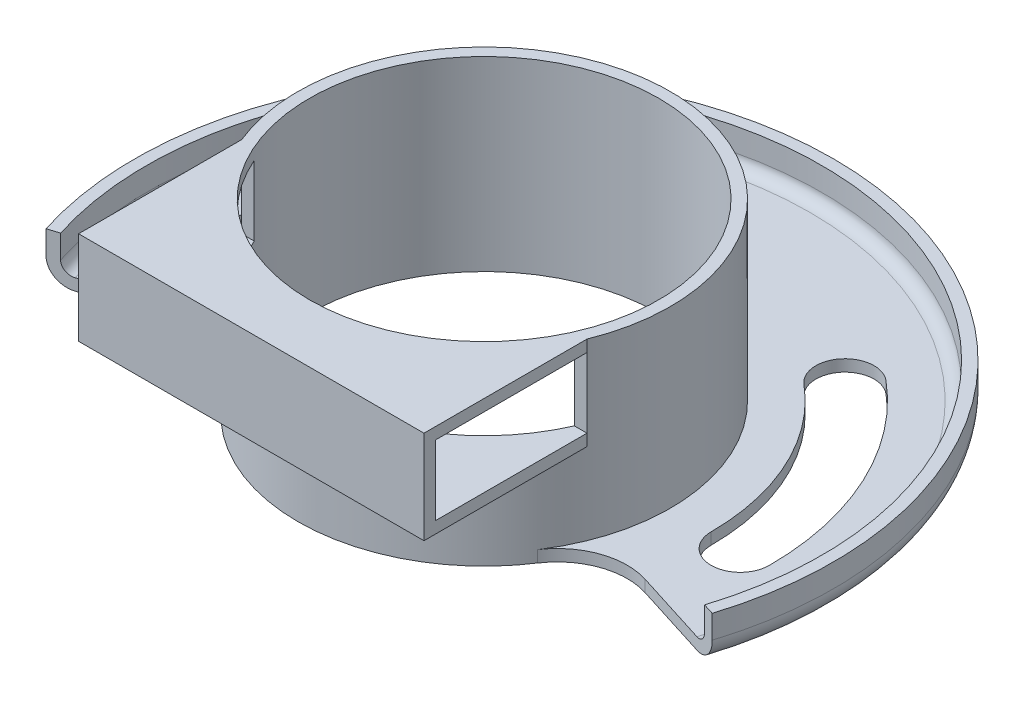
ISO-10303-21;
HEADER;
FILE_DESCRIPTION(('STEP AP214'),'2;1');
FILE_NAME('part.step','',(''),(''),'','','');
FILE_SCHEMA(('AUTOMOTIVE_DESIGN { 1 0 10303 214 1 1 1 1 }'));
ENDSEC;
DATA;
#1=APPLICATION_CONTEXT('core data for automotive mechanical design processes');
#2=APPLICATION_PROTOCOL_DEFINITION('international standard','automotive_design',2000,#1);
#3=PRODUCT_CONTEXT('',#1,'mechanical');
#4=PRODUCT('Part','Part','',(#3));
#5=PRODUCT_RELATED_PRODUCT_CATEGORY('part','',(#4));
#6=PRODUCT_DEFINITION_FORMATION('','',#4);
#7=PRODUCT_DEFINITION_CONTEXT('part definition',#1,'design');
#8=PRODUCT_DEFINITION('design','',#6,#7);
#9=PRODUCT_DEFINITION_SHAPE('','',#8);
#10=(LENGTH_UNIT() NAMED_UNIT(*) SI_UNIT(.MILLI.,.METRE.));
#11=(NAMED_UNIT(*) PLANE_ANGLE_UNIT() SI_UNIT($,.RADIAN.));
#12=(NAMED_UNIT(*) SI_UNIT($,.STERADIAN.) SOLID_ANGLE_UNIT());
#13=UNCERTAINTY_MEASURE_WITH_UNIT(LENGTH_MEASURE(1.E-05),#10,'distance_accuracy_value','');
#14=(GEOMETRIC_REPRESENTATION_CONTEXT(3) GLOBAL_UNCERTAINTY_ASSIGNED_CONTEXT((#13)) GLOBAL_UNIT_ASSIGNED_CONTEXT((#10,
#11,#12)) REPRESENTATION_CONTEXT('',''));
#15=CARTESIAN_POINT('',(0.,0.,0.));
#16=DIRECTION('',(0.,0.,1.));
#17=DIRECTION('',(1.,0.,0.));
#18=AXIS2_PLACEMENT_3D('',#15,#16,#17);
#19=CARTESIAN_POINT('',(14.8323969741913,8.,6.));
#20=DIRECTION('',(1.,0.,0.));
#21=DIRECTION('',(0.,0.,-1.));
#22=AXIS2_PLACEMENT_3D('',#19,#20,#21);
#23=PLANE('',#22);
#24=DIRECTION('',(0.,1.,0.));
#25=VECTOR('',#24,1.);
#26=CARTESIAN_POINT('',(14.8323969741913,8.,19.));
#27=LINE('',#26,#25);
#28=CARTESIAN_POINT('',(14.8323969741913,9.,19.));
#29=VERTEX_POINT('',#28);
#30=CARTESIAN_POINT('',(14.8323969741913,15.,19.));
#31=VERTEX_POINT('',#30);
#32=EDGE_CURVE('E182',#29,#31,#27,.T.);
#33=ORIENTED_EDGE('',*,*,#32,.T.);
#34=DIRECTION('',(0.,0.,-1.));
#35=VECTOR('',#34,1.);
#36=CARTESIAN_POINT('',(14.8323969741913,15.,0.));
#37=LINE('',#36,#35);
#38=CARTESIAN_POINT('',(14.8323969741913,15.,6.));
#39=VERTEX_POINT('',#38);
#40=EDGE_CURVE('E157',#31,#39,#37,.T.);
#41=ORIENTED_EDGE('',*,*,#40,.T.);
#42=DIRECTION('',(0.,1.,0.));
#43=VECTOR('',#42,1.);
#44=CARTESIAN_POINT('',(14.8323969741913,8.,6.));
#45=LINE('',#44,#43);
#46=CARTESIAN_POINT('',(14.8323969741913,16.,6.));
#47=VERTEX_POINT('',#46);
#48=EDGE_CURVE('E217',#39,#47,#45,.T.);
#49=ORIENTED_EDGE('',*,*,#48,.T.);
#50=DIRECTION('',(0.,0.,-1.));
#51=VECTOR('',#50,1.);
#52=CARTESIAN_POINT('',(14.8323969741913,16.,6.));
#53=LINE('',#52,#51);
#54=CARTESIAN_POINT('',(14.8323969741913,16.,20.));
#55=VERTEX_POINT('',#54);
#56=EDGE_CURVE('E188',#55,#47,#53,.T.);
#57=ORIENTED_EDGE('',*,*,#56,.F.);
#58=DIRECTION('',(0.,1.,0.));
#59=VECTOR('',#58,1.);
#60=CARTESIAN_POINT('',(14.8323969741913,8.,20.));
#61=LINE('',#60,#59);
#62=CARTESIAN_POINT('',(14.8323969741913,8.,20.));
#63=VERTEX_POINT('',#62);
#64=EDGE_CURVE('E218',#63,#55,#61,.T.);
#65=ORIENTED_EDGE('',*,*,#64,.F.);
#66=DIRECTION('',(0.,0.,-1.));
#67=VECTOR('',#66,1.);
#68=CARTESIAN_POINT('',(14.8323969741913,8.,6.));
#69=LINE('',#68,#67);
#70=CARTESIAN_POINT('',(14.8323969741913,8.,6.));
#71=VERTEX_POINT('',#70);
#72=EDGE_CURVE('E192',#63,#71,#69,.T.);
#73=ORIENTED_EDGE('',*,*,#72,.T.);
#74=CARTESIAN_POINT('',(14.8323969741913,9.,6.));
#75=VERTEX_POINT('',#74);
#76=EDGE_CURVE('E213',#71,#75,#45,.T.);
#77=ORIENTED_EDGE('',*,*,#76,.T.);
#78=DIRECTION('',(0.,0.,-1.));
#79=VECTOR('',#78,1.);
#80=CARTESIAN_POINT('',(14.8323969741913,9.,0.));
#81=LINE('',#80,#79);
#82=EDGE_CURVE('E166',#29,#75,#81,.T.);
#83=ORIENTED_EDGE('',*,*,#82,.F.);
#84=EDGE_LOOP('',(#33,#41,#49,#57,#65,#73,#77,#83));
#85=FACE_BOUND('',#84,.T.);
#86=ADVANCED_FACE('F53',(#85),#23,.T.);
#87=CARTESIAN_POINT('',(0.,16.,0.));
#88=DIRECTION('',(0.,-1.,0.));
#89=DIRECTION('',(0.,0.,-1.));
#90=AXIS2_PLACEMENT_3D('',#87,#88,#89);
#91=CYLINDRICAL_SURFACE('',#90,16.);
#92=CARTESIAN_POINT('',(0.,8.,0.));
#93=DIRECTION('',(0.,1.,0.));
#94=DIRECTION('',(0.,0.,1.));
#95=AXIS2_PLACEMENT_3D('',#92,#93,#94);
#96=CIRCLE('',#95,16.);
#97=CARTESIAN_POINT('',(-14.8323969741913,8.,6.));
#98=VERTEX_POINT('',#97);
#99=EDGE_CURVE('E211',#98,#71,#96,.T.);
#100=ORIENTED_EDGE('',*,*,#99,.F.);
#101=DIRECTION('',(0.,1.,0.));
#102=VECTOR('',#101,1.);
#103=CARTESIAN_POINT('',(-14.8323969741913,8.,6.));
#104=LINE('',#103,#102);
#105=CARTESIAN_POINT('',(-14.8323969741913,9.,6.));
#106=VERTEX_POINT('',#105);
#107=EDGE_CURVE('E207',#98,#106,#104,.T.);
#108=ORIENTED_EDGE('',*,*,#107,.T.);
#109=DIRECTION('',(0.,-1.,0.));
#110=VECTOR('',#109,1.);
#111=CARTESIAN_POINT('',(-14.8323969741913,9.,6.));
#112=LINE('',#111,#110);
#113=CARTESIAN_POINT('',(-14.8323969741913,15.,6.));
#114=VERTEX_POINT('',#113);
#115=EDGE_CURVE('E173',#106,#114,#112,.F.);
#116=ORIENTED_EDGE('',*,*,#115,.T.);
#117=CARTESIAN_POINT('',(-14.8323969741913,16.,6.));
#118=VERTEX_POINT('',#117);
#119=EDGE_CURVE('E212',#114,#118,#104,.T.);
#120=ORIENTED_EDGE('',*,*,#119,.T.);
#121=CARTESIAN_POINT('',(0.,16.,0.));
#122=DIRECTION('',(0.,1.,0.));
#123=DIRECTION('',(0.,0.,1.));
#124=AXIS2_PLACEMENT_3D('',#121,#122,#123);
#125=CIRCLE('',#124,16.);
#126=EDGE_CURVE('E151',#47,#118,#125,.T.);
#127=ORIENTED_EDGE('',*,*,#126,.F.);
#128=ORIENTED_EDGE('',*,*,#48,.F.);
#129=DIRECTION('',(0.,-1.,0.));
#130=VECTOR('',#129,1.);
#131=CARTESIAN_POINT('',(14.8323969741913,15.,6.));
#132=LINE('',#131,#130);
#133=EDGE_CURVE('E168',#39,#75,#132,.T.);
#134=ORIENTED_EDGE('',*,*,#133,.T.);
#135=ORIENTED_EDGE('',*,*,#76,.F.);
#136=EDGE_LOOP('',(#100,#108,#116,#120,#127,#128,#134,#135));
#137=FACE_BOUND('',#136,.T.);
#138=CARTESIAN_POINT('',(0.,0.,0.));
#139=DIRECTION('',(0.,1.,0.));
#140=DIRECTION('',(0.,0.,1.));
#141=AXIS2_PLACEMENT_3D('',#138,#139,#140);
#142=CIRCLE('',#141,16.);
#143=CARTESIAN_POINT('',(0.,0.,16.));
#144=VERTEX_POINT('',#143);
#145=EDGE_CURVE('E229',#144,#144,#142,.T.);
#146=ORIENTED_EDGE('',*,*,#145,.T.);
#147=EDGE_LOOP('',(#146));
#148=FACE_BOUND('',#147,.T.);
#149=ADVANCED_FACE('F55',(#137,#148),#91,.T.);
#150=CARTESIAN_POINT('',(0.,16.,0.));
#151=DIRECTION('',(0.,1.,0.));
#152=DIRECTION('',(0.,0.,1.));
#153=AXIS2_PLACEMENT_3D('',#150,#151,#152);
#154=PLANE('',#153);
#155=CARTESIAN_POINT('',(0.,16.,0.));
#156=DIRECTION('',(0.,1.,0.));
#157=DIRECTION('',(0.,0.,1.));
#158=AXIS2_PLACEMENT_3D('',#155,#156,#157);
#159=CIRCLE('',#158,15.);
#160=CARTESIAN_POINT('',(0.,16.,15.));
#161=VERTEX_POINT('',#160);
#162=EDGE_CURVE('E225',#161,#161,#159,.T.);
#163=ORIENTED_EDGE('',*,*,#162,.F.);
#164=EDGE_LOOP('',(#163));
#165=FACE_BOUND('',#164,.T.);
#166=ORIENTED_EDGE('',*,*,#126,.T.);
#167=DIRECTION('',(0.,0.,1.));
#168=VECTOR('',#167,1.);
#169=CARTESIAN_POINT('',(-14.8323969741913,16.,6.));
#170=LINE('',#169,#168);
#171=CARTESIAN_POINT('',(-14.8323969741913,16.,20.));
#172=VERTEX_POINT('',#171);
#173=EDGE_CURVE('E172',#118,#172,#170,.T.);
#174=ORIENTED_EDGE('',*,*,#173,.T.);
#175=DIRECTION('',(1.,0.,0.));
#176=VECTOR('',#175,1.);
#177=CARTESIAN_POINT('',(-14.8323969741913,16.,20.));
#178=LINE('',#177,#176);
#179=EDGE_CURVE('E200',#172,#55,#178,.T.);
#180=ORIENTED_EDGE('',*,*,#179,.T.);
#181=ORIENTED_EDGE('',*,*,#56,.T.);
#182=EDGE_LOOP('',(#166,#174,#180,#181));
#183=FACE_BOUND('',#182,.T.);
#184=ADVANCED_FACE('F240',(#165,#183),#154,.T.);
#185=CARTESIAN_POINT('',(0.,0.,0.));
#186=DIRECTION('',(0.,1.,0.));
#187=DIRECTION('',(0.,0.,1.));
#188=AXIS2_PLACEMENT_3D('',#185,#186,#187);
#189=PLANE('',#188);
#190=CARTESIAN_POINT('',(0.,0.,0.));
#191=DIRECTION('',(0.,1.,0.));
#192=DIRECTION('',(0.,0.,1.));
#193=AXIS2_PLACEMENT_3D('',#190,#191,#192);
#194=CIRCLE('',#193,15.);
#195=CARTESIAN_POINT('',(0.,0.,15.));
#196=VERTEX_POINT('',#195);
#197=EDGE_CURVE('E407',#196,#196,#194,.T.);
#198=ORIENTED_EDGE('',*,*,#197,.T.);
#199=EDGE_LOOP('',(#198));
#200=FACE_BOUND('',#199,.T.);
#201=ORIENTED_EDGE('',*,*,#145,.F.);
#202=EDGE_LOOP('',(#201));
#203=FACE_BOUND('',#202,.T.);
#204=ADVANCED_FACE('F238',(#200,#203),#189,.F.);
#205=CARTESIAN_POINT('',(0.,16.,0.));
#206=DIRECTION('',(0.,-1.,0.));
#207=DIRECTION('',(0.,0.,-1.));
#208=AXIS2_PLACEMENT_3D('',#205,#206,#207);
#209=CYLINDRICAL_SURFACE('',#208,15.);
#210=ORIENTED_EDGE('',*,*,#162,.T.);
#211=EDGE_LOOP('',(#210));
#212=FACE_BOUND('',#211,.T.);
#213=DIRECTION('',(0.,-1.,0.));
#214=VECTOR('',#213,1.);
#215=CARTESIAN_POINT('',(-13.7477270848675,16.,6.));
#216=LINE('',#215,#214);
#217=CARTESIAN_POINT('',(-13.7477270848675,9.,6.));
#218=VERTEX_POINT('',#217);
#219=CARTESIAN_POINT('',(-13.7477270848675,15.,6.));
#220=VERTEX_POINT('',#219);
#221=EDGE_CURVE('E62',#218,#220,#216,.F.);
#222=ORIENTED_EDGE('',*,*,#221,.F.);
#223=CARTESIAN_POINT('',(0.,9.,0.));
#224=DIRECTION('',(0.,1.,0.));
#225=DIRECTION('',(0.,0.,1.));
#226=AXIS2_PLACEMENT_3D('',#223,#224,#225);
#227=CIRCLE('',#226,15.);
#228=CARTESIAN_POINT('',(13.7477270848675,9.,6.));
#229=VERTEX_POINT('',#228);
#230=EDGE_CURVE('E142',#218,#229,#227,.T.);
#231=ORIENTED_EDGE('',*,*,#230,.T.);
#232=DIRECTION('',(0.,-1.,0.));
#233=VECTOR('',#232,1.);
#234=CARTESIAN_POINT('',(13.7477270848675,16.,6.));
#235=LINE('',#234,#233);
#236=CARTESIAN_POINT('',(13.7477270848675,15.,6.));
#237=VERTEX_POINT('',#236);
#238=EDGE_CURVE('E12',#237,#229,#235,.T.);
#239=ORIENTED_EDGE('',*,*,#238,.F.);
#240=CARTESIAN_POINT('',(0.,15.,0.));
#241=DIRECTION('',(0.,1.,0.));
#242=DIRECTION('',(0.,0.,1.));
#243=AXIS2_PLACEMENT_3D('',#240,#241,#242);
#244=CIRCLE('',#243,15.);
#245=EDGE_CURVE('E133',#220,#237,#244,.T.);
#246=ORIENTED_EDGE('',*,*,#245,.F.);
#247=EDGE_LOOP('',(#222,#231,#239,#246));
#248=FACE_BOUND('',#247,.T.);
#249=ORIENTED_EDGE('',*,*,#197,.F.);
#250=EDGE_LOOP('',(#249));
#251=FACE_BOUND('',#250,.T.);
#252=ADVANCED_FACE('F135',(#212,#248,#251),#209,.F.);
#253=CARTESIAN_POINT('',(-14.8323969741913,8.,6.));
#254=DIRECTION('',(-1.,0.,0.));
#255=DIRECTION('',(0.,0.,1.));
#256=AXIS2_PLACEMENT_3D('',#253,#254,#255);
#257=PLANE('',#256);
#258=DIRECTION('',(0.,0.,1.));
#259=VECTOR('',#258,1.);
#260=CARTESIAN_POINT('',(-14.8323969741913,9.,0.));
#261=LINE('',#260,#259);
#262=CARTESIAN_POINT('',(-14.8323969741913,9.,19.));
#263=VERTEX_POINT('',#262);
#264=EDGE_CURVE('E161',#106,#263,#261,.T.);
#265=ORIENTED_EDGE('',*,*,#264,.F.);
#266=ORIENTED_EDGE('',*,*,#107,.F.);
#267=DIRECTION('',(0.,0.,1.));
#268=VECTOR('',#267,1.);
#269=CARTESIAN_POINT('',(-14.8323969741913,8.,6.));
#270=LINE('',#269,#268);
#271=CARTESIAN_POINT('',(-14.8323969741913,8.,20.));
#272=VERTEX_POINT('',#271);
#273=EDGE_CURVE('E183',#98,#272,#270,.T.);
#274=ORIENTED_EDGE('',*,*,#273,.T.);
#275=DIRECTION('',(0.,1.,0.));
#276=VECTOR('',#275,1.);
#277=CARTESIAN_POINT('',(-14.8323969741913,8.,20.));
#278=LINE('',#277,#276);
#279=EDGE_CURVE('E196',#272,#172,#278,.T.);
#280=ORIENTED_EDGE('',*,*,#279,.T.);
#281=ORIENTED_EDGE('',*,*,#173,.F.);
#282=ORIENTED_EDGE('',*,*,#119,.F.);
#283=DIRECTION('',(0.,0.,1.));
#284=VECTOR('',#283,1.);
#285=CARTESIAN_POINT('',(-14.8323969741913,15.,0.));
#286=LINE('',#285,#284);
#287=CARTESIAN_POINT('',(-14.8323969741913,15.,19.));
#288=VERTEX_POINT('',#287);
#289=EDGE_CURVE('E141',#114,#288,#286,.T.);
#290=ORIENTED_EDGE('',*,*,#289,.T.);
#291=DIRECTION('',(0.,1.,0.));
#292=VECTOR('',#291,1.);
#293=CARTESIAN_POINT('',(-14.8323969741913,8.,19.));
#294=LINE('',#293,#292);
#295=EDGE_CURVE('E178',#263,#288,#294,.T.);
#296=ORIENTED_EDGE('',*,*,#295,.F.);
#297=EDGE_LOOP('',(#265,#266,#274,#280,#281,#282,#290,#296));
#298=FACE_BOUND('',#297,.T.);
#299=ADVANCED_FACE('F246',(#298),#257,.T.);
#300=CARTESIAN_POINT('',(-14.8323969741913,8.,20.));
#301=DIRECTION('',(0.,0.,1.));
#302=DIRECTION('',(1.,0.,0.));
#303=AXIS2_PLACEMENT_3D('',#300,#301,#302);
#304=PLANE('',#303);
#305=ORIENTED_EDGE('',*,*,#179,.F.);
#306=ORIENTED_EDGE('',*,*,#279,.F.);
#307=DIRECTION('',(1.,0.,0.));
#308=VECTOR('',#307,1.);
#309=CARTESIAN_POINT('',(-14.8323969741913,8.,20.));
#310=LINE('',#309,#308);
#311=EDGE_CURVE('E187',#272,#63,#310,.T.);
#312=ORIENTED_EDGE('',*,*,#311,.T.);
#313=ORIENTED_EDGE('',*,*,#64,.T.);
#314=EDGE_LOOP('',(#305,#306,#312,#313));
#315=FACE_BOUND('',#314,.T.);
#316=ADVANCED_FACE('F264',(#315),#304,.T.);
#317=CARTESIAN_POINT('',(0.,8.,0.));
#318=DIRECTION('',(0.,1.,0.));
#319=DIRECTION('',(0.,0.,1.));
#320=AXIS2_PLACEMENT_3D('',#317,#318,#319);
#321=PLANE('',#320);
#322=ORIENTED_EDGE('',*,*,#273,.F.);
#323=ORIENTED_EDGE('',*,*,#99,.T.);
#324=ORIENTED_EDGE('',*,*,#72,.F.);
#325=ORIENTED_EDGE('',*,*,#311,.F.);
#326=EDGE_LOOP('',(#322,#323,#324,#325));
#327=FACE_BOUND('',#326,.T.);
#328=ADVANCED_FACE('F262',(#327),#321,.F.);
#329=CARTESIAN_POINT('',(14.8323969741913,8.,6.));
#330=DIRECTION('',(0.,0.,-1.));
#331=DIRECTION('',(-1.,0.,0.));
#332=AXIS2_PLACEMENT_3D('',#329,#330,#331);
#333=PLANE('',#332);
#334=ORIENTED_EDGE('',*,*,#238,.T.);
#335=DIRECTION('',(-1.,0.,0.));
#336=VECTOR('',#335,1.);
#337=CARTESIAN_POINT('',(0.,9.,6.));
#338=LINE('',#337,#336);
#339=EDGE_CURVE('E174',#75,#229,#338,.T.);
#340=ORIENTED_EDGE('',*,*,#339,.F.);
#341=ORIENTED_EDGE('',*,*,#133,.F.);
#342=DIRECTION('',(-1.,0.,0.));
#343=VECTOR('',#342,1.);
#344=CARTESIAN_POINT('',(0.,15.,6.));
#345=LINE('',#344,#343);
#346=EDGE_CURVE('E156',#39,#237,#345,.T.);
#347=ORIENTED_EDGE('',*,*,#346,.T.);
#348=EDGE_LOOP('',(#334,#340,#341,#347));
#349=FACE_BOUND('',#348,.T.);
#350=ADVANCED_FACE('F306',(#349),#333,.F.);
#351=CARTESIAN_POINT('',(0.,15.,0.));
#352=DIRECTION('',(0.,1.,0.));
#353=DIRECTION('',(0.,0.,1.));
#354=AXIS2_PLACEMENT_3D('',#351,#352,#353);
#355=PLANE('',#354);
#356=EDGE_CURVE('E148',#220,#114,#345,.T.);
#357=ORIENTED_EDGE('',*,*,#356,.F.);
#358=ORIENTED_EDGE('',*,*,#245,.T.);
#359=ORIENTED_EDGE('',*,*,#346,.F.);
#360=ORIENTED_EDGE('',*,*,#40,.F.);
#361=DIRECTION('',(1.,0.,0.));
#362=VECTOR('',#361,1.);
#363=CARTESIAN_POINT('',(0.,15.,19.));
#364=LINE('',#363,#362);
#365=EDGE_CURVE('E69',#288,#31,#364,.T.);
#366=ORIENTED_EDGE('',*,*,#365,.F.);
#367=ORIENTED_EDGE('',*,*,#289,.F.);
#368=EDGE_LOOP('',(#357,#358,#359,#360,#366,#367));
#369=FACE_BOUND('',#368,.T.);
#370=ADVANCED_FACE('F152',(#369),#355,.F.);
#371=CARTESIAN_POINT('',(0.,9.,0.));
#372=DIRECTION('',(0.,1.,0.));
#373=DIRECTION('',(0.,0.,1.));
#374=AXIS2_PLACEMENT_3D('',#371,#372,#373);
#375=PLANE('',#374);
#376=ORIENTED_EDGE('',*,*,#230,.F.);
#377=EDGE_CURVE('E149',#218,#106,#338,.T.);
#378=ORIENTED_EDGE('',*,*,#377,.T.);
#379=ORIENTED_EDGE('',*,*,#264,.T.);
#380=DIRECTION('',(1.,0.,0.));
#381=VECTOR('',#380,1.);
#382=CARTESIAN_POINT('',(0.,9.,19.));
#383=LINE('',#382,#381);
#384=EDGE_CURVE('E77',#263,#29,#383,.T.);
#385=ORIENTED_EDGE('',*,*,#384,.T.);
#386=ORIENTED_EDGE('',*,*,#82,.T.);
#387=ORIENTED_EDGE('',*,*,#339,.T.);
#388=EDGE_LOOP('',(#376,#378,#379,#385,#386,#387));
#389=FACE_BOUND('',#388,.T.);
#390=ADVANCED_FACE('F304',(#389),#375,.T.);
#391=ORIENTED_EDGE('',*,*,#221,.T.);
#392=ORIENTED_EDGE('',*,*,#356,.T.);
#393=ORIENTED_EDGE('',*,*,#115,.F.);
#394=ORIENTED_EDGE('',*,*,#377,.F.);
#395=EDGE_LOOP('',(#391,#392,#393,#394));
#396=FACE_BOUND('',#395,.T.);
#397=ADVANCED_FACE('F146',(#396),#333,.F.);
#398=CARTESIAN_POINT('',(-14.8323969741913,8.,19.));
#399=DIRECTION('',(0.,0.,1.));
#400=DIRECTION('',(1.,0.,0.));
#401=AXIS2_PLACEMENT_3D('',#398,#399,#400);
#402=PLANE('',#401);
#403=ORIENTED_EDGE('',*,*,#365,.T.);
#404=ORIENTED_EDGE('',*,*,#32,.F.);
#405=ORIENTED_EDGE('',*,*,#384,.F.);
#406=ORIENTED_EDGE('',*,*,#295,.T.);
#407=EDGE_LOOP('',(#403,#404,#405,#406));
#408=FACE_BOUND('',#407,.T.);
#409=ADVANCED_FACE('F303',(#408),#402,.F.);
#410=CLOSED_SHELL('',(#86,#149,#184,#204,#252,#299,#316,#328,#350,#370,#390,#397,#409));
#411=MANIFOLD_SOLID_BREP('B2',#410);
#412=CARTESIAN_POINT('',(0.,0.,0.));
#413=DIRECTION('',(0.,1.,0.));
#414=DIRECTION('',(0.,0.,1.));
#415=AXIS2_PLACEMENT_3D('',#412,#413,#414);
#416=PLANE('',#415);
#417=CARTESIAN_POINT('',(-18.3821481855875,0.,12.0870438107547));
#418=DIRECTION('',(0.,1.,0.));
#419=DIRECTION('',(0.,0.,1.));
#420=AXIS2_PLACEMENT_3D('',#417,#418,#419);
#421=CIRCLE('',#420,6.);
#422=CARTESIAN_POINT('',(-20.1863829826131,0.,6.36474210626534));
#423=VERTEX_POINT('',#422);
#424=CARTESIAN_POINT('',(-13.3688350440636,0.,8.79057731691251));
#425=VERTEX_POINT('',#424);
#426=EDGE_CURVE('E631',#423,#425,#421,.F.);
#427=ORIENTED_EDGE('',*,*,#426,.F.);
#428=DIRECTION('',(0.953716950748226,0.,-0.300705799504277));
#429=VECTOR('',#428,1.);
#430=CARTESIAN_POINT('',(-28.6115085224468,0.,9.02117398512832));
#431=LINE('',#430,#429);
#432=CARTESIAN_POINT('',(-26.7040746209503,0.,8.41976238611977));
#433=VERTEX_POINT('',#432);
#434=EDGE_CURVE('E633',#433,#423,#431,.T.);
#435=ORIENTED_EDGE('',*,*,#434,.F.);
#436=CARTESIAN_POINT('',(0.,0.,0.));
#437=DIRECTION('',(0.,1.,0.));
#438=DIRECTION('',(0.,0.,1.));
#439=AXIS2_PLACEMENT_3D('',#436,#437,#438);
#440=CIRCLE('',#439,28.);
#441=CARTESIAN_POINT('',(26.7040746209503,0.,8.41976238611978));
#442=VERTEX_POINT('',#441);
#443=EDGE_CURVE('E51',#433,#442,#440,.F.);
#444=ORIENTED_EDGE('',*,*,#443,.T.);
#445=DIRECTION('',(0.953716950748225,0.,0.300705799504278));
#446=VECTOR('',#445,1.);
#447=CARTESIAN_POINT('',(28.6115085224468,0.,9.02117398512832));
#448=LINE('',#447,#446);
#449=CARTESIAN_POINT('',(20.1863829826131,0.,6.36474210626533));
#450=VERTEX_POINT('',#449);
#451=EDGE_CURVE('E663',#450,#442,#448,.T.);
#452=ORIENTED_EDGE('',*,*,#451,.F.);
#453=CARTESIAN_POINT('',(18.3821481855875,0.,12.0870438107547));
#454=DIRECTION('',(0.,1.,0.));
#455=DIRECTION('',(0.,0.,1.));
#456=AXIS2_PLACEMENT_3D('',#453,#454,#455);
#457=CIRCLE('',#456,6.);
#458=CARTESIAN_POINT('',(13.3688350440636,0.,8.7905773169125));
#459=VERTEX_POINT('',#458);
#460=EDGE_CURVE('E629',#459,#450,#457,.F.);
#461=ORIENTED_EDGE('',*,*,#460,.F.);
#462=CARTESIAN_POINT('',(0.,0.,0.));
#463=DIRECTION('',(0.,1.,0.));
#464=DIRECTION('',(0.,0.,1.));
#465=AXIS2_PLACEMENT_3D('',#462,#463,#464);
#466=CIRCLE('',#465,16.);
#467=EDGE_CURVE('E669',#459,#425,#466,.T.);
#468=ORIENTED_EDGE('',*,*,#467,.T.);
#469=EDGE_LOOP('',(#427,#435,#444,#452,#461,#468));
#470=FACE_BOUND('',#469,.T.);
#471=CARTESIAN_POINT('',(0.,0.,0.));
#472=DIRECTION('',(0.,1.,0.));
#473=DIRECTION('',(0.,0.,1.));
#474=AXIS2_PLACEMENT_3D('',#471,#472,#473);
#475=CIRCLE('',#474,24.5);
#476=CARTESIAN_POINT('',(15.7482964373203,0.,-18.7680888564149));
#477=VERTEX_POINT('',#476);
#478=CARTESIAN_POINT('',(24.5,0.,0.));
#479=VERTEX_POINT('',#478);
#480=EDGE_CURVE('E581',#477,#479,#475,.F.);
#481=ORIENTED_EDGE('',*,*,#480,.F.);
#482=CARTESIAN_POINT('',(14.141327413104,0.,-16.8529777486174));
#483=DIRECTION('',(0.,1.,0.));
#484=DIRECTION('',(0.,0.,1.));
#485=AXIS2_PLACEMENT_3D('',#482,#483,#484);
#486=CIRCLE('',#485,2.5);
#487=CARTESIAN_POINT('',(12.5343583888876,0.,-14.93786664082));
#488=VERTEX_POINT('',#487);
#489=EDGE_CURVE('E584',#488,#477,#486,.F.);
#490=ORIENTED_EDGE('',*,*,#489,.F.);
#491=CARTESIAN_POINT('',(0.,0.,0.));
#492=DIRECTION('',(0.,1.,0.));
#493=DIRECTION('',(0.,0.,1.));
#494=AXIS2_PLACEMENT_3D('',#491,#492,#493);
#495=CIRCLE('',#494,19.5);
#496=CARTESIAN_POINT('',(19.5,0.,0.));
#497=VERTEX_POINT('',#496);
#498=EDGE_CURVE('E601',#497,#488,#495,.T.);
#499=ORIENTED_EDGE('',*,*,#498,.F.);
#500=CARTESIAN_POINT('',(22.,0.,0.));
#501=DIRECTION('',(0.,1.,0.));
#502=DIRECTION('',(0.,0.,1.));
#503=AXIS2_PLACEMENT_3D('',#500,#501,#502);
#504=CIRCLE('',#503,2.5);
#505=EDGE_CURVE('E439',#479,#497,#504,.F.);
#506=ORIENTED_EDGE('',*,*,#505,.F.);
#507=EDGE_LOOP('',(#481,#490,#499,#506));
#508=FACE_BOUND('',#507,.T.);
#509=CARTESIAN_POINT('',(0.,0.,0.));
#510=DIRECTION('',(0.,1.,0.));
#511=DIRECTION('',(0.,0.,1.));
#512=AXIS2_PLACEMENT_3D('',#509,#510,#511);
#513=CIRCLE('',#512,19.5);
#514=CARTESIAN_POINT('',(-12.5343583888876,0.,-14.93786664082));
#515=VERTEX_POINT('',#514);
#516=CARTESIAN_POINT('',(-19.5,0.,0.));
#517=VERTEX_POINT('',#516);
#518=EDGE_CURVE('E563',#515,#517,#513,.T.);
#519=ORIENTED_EDGE('',*,*,#518,.F.);
#520=CARTESIAN_POINT('',(-14.141327413104,0.,-16.8529777486174));
#521=DIRECTION('',(0.,1.,0.));
#522=DIRECTION('',(0.,0.,1.));
#523=AXIS2_PLACEMENT_3D('',#520,#521,#522);
#524=CIRCLE('',#523,2.5);
#525=CARTESIAN_POINT('',(-15.7482964373203,0.,-18.7680888564149));
#526=VERTEX_POINT('',#525);
#527=EDGE_CURVE('E545',#526,#515,#524,.F.);
#528=ORIENTED_EDGE('',*,*,#527,.F.);
#529=CARTESIAN_POINT('',(0.,0.,0.));
#530=DIRECTION('',(0.,1.,0.));
#531=DIRECTION('',(0.,0.,1.));
#532=AXIS2_PLACEMENT_3D('',#529,#530,#531);
#533=CIRCLE('',#532,24.5);
#534=CARTESIAN_POINT('',(-24.5,0.,0.));
#535=VERTEX_POINT('',#534);
#536=EDGE_CURVE('E556',#535,#526,#533,.F.);
#537=ORIENTED_EDGE('',*,*,#536,.F.);
#538=CARTESIAN_POINT('',(-22.,0.,0.));
#539=DIRECTION('',(0.,1.,0.));
#540=DIRECTION('',(0.,0.,1.));
#541=AXIS2_PLACEMENT_3D('',#538,#539,#540);
#542=CIRCLE('',#541,2.5);
#543=EDGE_CURVE('E431',#517,#535,#542,.F.);
#544=ORIENTED_EDGE('',*,*,#543,.F.);
#545=EDGE_LOOP('',(#519,#528,#537,#544));
#546=FACE_BOUND('',#545,.T.);
#547=ADVANCED_FACE('F416',(#470,#508,#546),#416,.F.);
#548=CARTESIAN_POINT('',(0.,1.,0.));
#549=DIRECTION('',(0.,1.,0.));
#550=DIRECTION('',(0.,0.,1.));
#551=AXIS2_PLACEMENT_3D('',#548,#549,#550);
#552=PLANE('',#551);
#553=CARTESIAN_POINT('',(14.141327413104,1.,-16.8529777486174));
#554=DIRECTION('',(0.,1.,0.));
#555=DIRECTION('',(0.,0.,-1.));
#556=AXIS2_PLACEMENT_3D('',#553,#554,#555);
#557=CIRCLE('',#556,2.5);
#558=CARTESIAN_POINT('',(15.7482964373203,1.,-18.7680888564149));
#559=VERTEX_POINT('',#558);
#560=CARTESIAN_POINT('',(12.5343583888876,1.,-14.93786664082));
#561=VERTEX_POINT('',#560);
#562=EDGE_CURVE('E587',#559,#561,#557,.T.);
#563=ORIENTED_EDGE('',*,*,#562,.F.);
#564=CARTESIAN_POINT('',(0.,1.,0.));
#565=DIRECTION('',(0.,1.,0.));
#566=DIRECTION('',(0.,0.,-1.));
#567=AXIS2_PLACEMENT_3D('',#564,#565,#566);
#568=CIRCLE('',#567,24.5);
#569=CARTESIAN_POINT('',(24.5,1.,0.));
#570=VERTEX_POINT('',#569);
#571=EDGE_CURVE('E595',#570,#559,#568,.T.);
#572=ORIENTED_EDGE('',*,*,#571,.F.);
#573=CARTESIAN_POINT('',(22.,1.,0.));
#574=DIRECTION('',(0.,1.,0.));
#575=DIRECTION('',(0.,0.,-1.));
#576=AXIS2_PLACEMENT_3D('',#573,#574,#575);
#577=CIRCLE('',#576,2.5);
#578=CARTESIAN_POINT('',(19.5,1.,0.));
#579=VERTEX_POINT('',#578);
#580=EDGE_CURVE('E592',#579,#570,#577,.T.);
#581=ORIENTED_EDGE('',*,*,#580,.F.);
#582=CARTESIAN_POINT('',(0.,1.,0.));
#583=DIRECTION('',(0.,-1.,0.));
#584=DIRECTION('',(0.,0.,-1.));
#585=AXIS2_PLACEMENT_3D('',#582,#583,#584);
#586=CIRCLE('',#585,19.5);
#587=EDGE_CURVE('E589',#561,#579,#586,.T.);
#588=ORIENTED_EDGE('',*,*,#587,.F.);
#589=EDGE_LOOP('',(#563,#572,#581,#588));
#590=FACE_BOUND('',#589,.T.);
#591=DIRECTION('',(0.953716950748226,0.,-0.300705799504277));
#592=VECTOR('',#591,1.);
#593=CARTESIAN_POINT('',(-28.6115085224468,1.,9.02117398512832));
#594=LINE('',#593,#592);
#595=CARTESIAN_POINT('',(-26.7040746209503,1.,8.41976238611976));
#596=VERTEX_POINT('',#595);
#597=CARTESIAN_POINT('',(-20.1863829826131,1.,6.36474210626534));
#598=VERTEX_POINT('',#597);
#599=EDGE_CURVE('E623',#596,#598,#594,.T.);
#600=ORIENTED_EDGE('',*,*,#599,.T.);
#601=CARTESIAN_POINT('',(-18.3821481855875,1.,12.0870438107547));
#602=DIRECTION('',(0.,1.,0.));
#603=DIRECTION('',(0.,0.,1.));
#604=AXIS2_PLACEMENT_3D('',#601,#602,#603);
#605=CIRCLE('',#604,6.);
#606=CARTESIAN_POINT('',(-13.3688350440636,1.,8.79057731691251));
#607=VERTEX_POINT('',#606);
#608=EDGE_CURVE('E620',#598,#607,#605,.F.);
#609=ORIENTED_EDGE('',*,*,#608,.T.);
#610=CARTESIAN_POINT('',(0.,1.,0.));
#611=DIRECTION('',(0.,1.,0.));
#612=DIRECTION('',(0.,0.,1.));
#613=AXIS2_PLACEMENT_3D('',#610,#611,#612);
#614=CIRCLE('',#613,16.);
#615=CARTESIAN_POINT('',(13.3688350440636,1.,8.7905773169125));
#616=VERTEX_POINT('',#615);
#617=EDGE_CURVE('E665',#616,#607,#614,.T.);
#618=ORIENTED_EDGE('',*,*,#617,.F.);
#619=CARTESIAN_POINT('',(18.3821481855875,1.,12.0870438107547));
#620=DIRECTION('',(0.,1.,0.));
#621=DIRECTION('',(0.,0.,1.));
#622=AXIS2_PLACEMENT_3D('',#619,#620,#621);
#623=CIRCLE('',#622,6.);
#624=CARTESIAN_POINT('',(20.1863829826131,1.,6.36474210626533));
#625=VERTEX_POINT('',#624);
#626=EDGE_CURVE('E617',#616,#625,#623,.F.);
#627=ORIENTED_EDGE('',*,*,#626,.T.);
#628=DIRECTION('',(0.953716950748225,0.,0.300705799504278));
#629=VECTOR('',#628,1.);
#630=CARTESIAN_POINT('',(28.6115085224468,1.,9.02117398512832));
#631=LINE('',#630,#629);
#632=CARTESIAN_POINT('',(26.7040746209503,1.,8.41976238611978));
#633=VERTEX_POINT('',#632);
#634=EDGE_CURVE('E657',#625,#633,#631,.T.);
#635=ORIENTED_EDGE('',*,*,#634,.T.);
#636=CARTESIAN_POINT('',(0.,1.,0.));
#637=DIRECTION('',(0.,1.,0.));
#638=DIRECTION('',(0.,0.,1.));
#639=AXIS2_PLACEMENT_3D('',#636,#637,#638);
#640=CIRCLE('',#639,28.);
#641=EDGE_CURVE('E666',#596,#633,#640,.F.);
#642=ORIENTED_EDGE('',*,*,#641,.F.);
#643=EDGE_LOOP('',(#600,#609,#618,#627,#635,#642));
#644=FACE_BOUND('',#643,.T.);
#645=CARTESIAN_POINT('',(-14.141327413104,1.,-16.8529777486174));
#646=DIRECTION('',(0.,1.,0.));
#647=DIRECTION('',(0.,0.,1.));
#648=AXIS2_PLACEMENT_3D('',#645,#646,#647);
#649=CIRCLE('',#648,2.5);
#650=CARTESIAN_POINT('',(-12.5343583888876,1.,-14.93786664082));
#651=VERTEX_POINT('',#650);
#652=CARTESIAN_POINT('',(-15.7482964373203,1.,-18.7680888564149));
#653=VERTEX_POINT('',#652);
#654=EDGE_CURVE('E548',#651,#653,#649,.T.);
#655=ORIENTED_EDGE('',*,*,#654,.F.);
#656=CARTESIAN_POINT('',(0.,1.,0.));
#657=DIRECTION('',(0.,-1.,0.));
#658=DIRECTION('',(0.,0.,1.));
#659=AXIS2_PLACEMENT_3D('',#656,#657,#658);
#660=CIRCLE('',#659,19.5);
#661=CARTESIAN_POINT('',(-19.5,1.,0.));
#662=VERTEX_POINT('',#661);
#663=EDGE_CURVE('E553',#662,#651,#660,.T.);
#664=ORIENTED_EDGE('',*,*,#663,.F.);
#665=CARTESIAN_POINT('',(-22.,1.,0.));
#666=DIRECTION('',(0.,1.,0.));
#667=DIRECTION('',(0.,0.,1.));
#668=AXIS2_PLACEMENT_3D('',#665,#666,#667);
#669=CIRCLE('',#668,2.5);
#670=CARTESIAN_POINT('',(-24.5,1.,0.));
#671=VERTEX_POINT('',#670);
#672=EDGE_CURVE('E571',#671,#662,#669,.T.);
#673=ORIENTED_EDGE('',*,*,#672,.F.);
#674=CARTESIAN_POINT('',(0.,1.,0.));
#675=DIRECTION('',(0.,1.,0.));
#676=DIRECTION('',(0.,0.,1.));
#677=AXIS2_PLACEMENT_3D('',#674,#675,#676);
#678=CIRCLE('',#677,24.5);
#679=EDGE_CURVE('E565',#653,#671,#678,.T.);
#680=ORIENTED_EDGE('',*,*,#679,.F.);
#681=EDGE_LOOP('',(#655,#664,#673,#680));
#682=FACE_BOUND('',#681,.T.);
#683=ADVANCED_FACE('F707',(#590,#644,#682),#552,.T.);
#684=CARTESIAN_POINT('',(0.,4.,0.));
#685=DIRECTION('',(0.,-1.,0.));
#686=DIRECTION('',(0.,0.,-1.));
#687=AXIS2_PLACEMENT_3D('',#684,#685,#686);
#688=CYLINDRICAL_SURFACE('',#687,16.);
#689=DIRECTION('',(0.,1.,0.));
#690=VECTOR('',#689,1.);
#691=CARTESIAN_POINT('',(-13.3688350440636,-0.00100000000000013,8.7905773169125));
#692=LINE('',#691,#690);
#693=EDGE_CURVE('E647',#425,#607,#692,.T.);
#694=ORIENTED_EDGE('',*,*,#693,.F.);
#695=ORIENTED_EDGE('',*,*,#467,.F.);
#696=DIRECTION('',(0.,1.,0.));
#697=VECTOR('',#696,1.);
#698=CARTESIAN_POINT('',(13.3688350440636,-0.00100000000000013,8.79057731691251));
#699=LINE('',#698,#697);
#700=EDGE_CURVE('E649',#459,#616,#699,.T.);
#701=ORIENTED_EDGE('',*,*,#700,.T.);
#702=ORIENTED_EDGE('',*,*,#617,.T.);
#703=EDGE_LOOP('',(#694,#695,#701,#702));
#704=FACE_BOUND('',#703,.T.);
#705=ADVANCED_FACE('F704',(#704),#688,.F.);
#706=CARTESIAN_POINT('',(0.,4.,0.));
#707=DIRECTION('',(0.,1.,0.));
#708=DIRECTION('',(0.,0.,1.));
#709=AXIS2_PLACEMENT_3D('',#706,#707,#708);
#710=PLANE('',#709);
#711=DIRECTION('',(-0.953716950748225,0.,0.300705799504277));
#712=VECTOR('',#711,1.);
#713=CARTESIAN_POINT('',(-28.6115085224468,4.,9.02117398512832));
#714=LINE('',#713,#712);
#715=CARTESIAN_POINT('',(-27.6577915716985,4.,8.72046818562404));
#716=VERTEX_POINT('',#715);
#717=CARTESIAN_POINT('',(-28.6115085224468,4.,9.02117398512832));
#718=VERTEX_POINT('',#717);
#719=EDGE_CURVE('E637',#716,#718,#714,.T.);
#720=ORIENTED_EDGE('',*,*,#719,.F.);
#721=CARTESIAN_POINT('',(0.,4.,0.));
#722=DIRECTION('',(0.,1.,0.));
#723=DIRECTION('',(0.,0.,1.));
#724=AXIS2_PLACEMENT_3D('',#721,#722,#723);
#725=CIRCLE('',#724,29.);
#726=CARTESIAN_POINT('',(27.6577915716985,4.,8.72046818562404));
#727=VERTEX_POINT('',#726);
#728=EDGE_CURVE('E673',#727,#716,#725,.T.);
#729=ORIENTED_EDGE('',*,*,#728,.F.);
#730=DIRECTION('',(-0.953716950748225,0.,-0.300705799504278));
#731=VECTOR('',#730,1.);
#732=CARTESIAN_POINT('',(28.6115085224468,4.,9.02117398512832));
#733=LINE('',#732,#731);
#734=CARTESIAN_POINT('',(28.6115085224468,4.,9.02117398512832));
#735=VERTEX_POINT('',#734);
#736=EDGE_CURVE('E635',#735,#727,#733,.T.);
#737=ORIENTED_EDGE('',*,*,#736,.F.);
#738=CARTESIAN_POINT('',(0.,4.,0.));
#739=DIRECTION('',(0.,1.,0.));
#740=DIRECTION('',(0.,0.,1.));
#741=AXIS2_PLACEMENT_3D('',#738,#739,#740);
#742=CIRCLE('',#741,30.);
#743=EDGE_CURVE('E680',#735,#718,#742,.T.);
#744=ORIENTED_EDGE('',*,*,#743,.T.);
#745=EDGE_LOOP('',(#720,#729,#737,#744));
#746=FACE_BOUND('',#745,.T.);
#747=ADVANCED_FACE('F724',(#746),#710,.T.);
#748=CARTESIAN_POINT('',(0.,4.,0.));
#749=DIRECTION('',(0.,-1.,0.));
#750=DIRECTION('',(0.,0.,-1.));
#751=AXIS2_PLACEMENT_3D('',#748,#749,#750);
#752=CYLINDRICAL_SURFACE('',#751,30.);
#753=CARTESIAN_POINT('',(0.,2.,0.));
#754=DIRECTION('',(0.,1.,0.));
#755=DIRECTION('',(0.,0.,1.));
#756=AXIS2_PLACEMENT_3D('',#753,#754,#755);
#757=CIRCLE('',#756,30.);
#758=CARTESIAN_POINT('',(28.6115085224468,2.,9.02117398512834));
#759=VERTEX_POINT('',#758);
#760=CARTESIAN_POINT('',(-28.6115085224468,2.,9.02117398512832));
#761=VERTEX_POINT('',#760);
#762=EDGE_CURVE('E424',#759,#761,#757,.T.);
#763=ORIENTED_EDGE('',*,*,#762,.T.);
#764=DIRECTION('',(0.,1.,0.));
#765=VECTOR('',#764,1.);
#766=CARTESIAN_POINT('',(-28.6115085224468,-0.00100000000000013,9.02117398512832));
#767=LINE('',#766,#765);
#768=EDGE_CURVE('E640',#761,#718,#767,.T.);
#769=ORIENTED_EDGE('',*,*,#768,.T.);
#770=ORIENTED_EDGE('',*,*,#743,.F.);
#771=DIRECTION('',(0.,1.,0.));
#772=VECTOR('',#771,1.);
#773=CARTESIAN_POINT('',(28.6115085224468,-0.00100000000000013,9.02117398512832));
#774=LINE('',#773,#772);
#775=EDGE_CURVE('E639',#759,#735,#774,.T.);
#776=ORIENTED_EDGE('',*,*,#775,.F.);
#777=EDGE_LOOP('',(#763,#769,#770,#776));
#778=FACE_BOUND('',#777,.T.);
#779=ADVANCED_FACE('F686',(#778),#752,.T.);
#780=CARTESIAN_POINT('',(0.,2.,0.));
#781=DIRECTION('',(0.,1.,0.));
#782=DIRECTION('',(0.,0.,1.));
#783=AXIS2_PLACEMENT_3D('',#780,#781,#782);
#784=TOROIDAL_SURFACE('',#783,28.,2.);
#785=CARTESIAN_POINT('',(-26.7040746209503,2.,8.41976238611977));
#786=DIRECTION('',(-0.300705799504277,0.,-0.953716950748225));
#787=DIRECTION('',(-0.953716950748226,0.,0.300705799504277));
#788=AXIS2_PLACEMENT_3D('',#785,#786,#787);
#789=CIRCLE('',#788,2.);
#790=EDGE_CURVE('E626',#433,#761,#789,.T.);
#791=ORIENTED_EDGE('',*,*,#790,.T.);
#792=ORIENTED_EDGE('',*,*,#762,.F.);
#793=CARTESIAN_POINT('',(26.7040746209503,2.,8.41976238611978));
#794=DIRECTION('',(0.300705799504278,0.,-0.953716950748225));
#795=DIRECTION('',(-0.953716950748225,0.,-0.300705799504278));
#796=AXIS2_PLACEMENT_3D('',#793,#794,#795);
#797=CIRCLE('',#796,2.);
#798=EDGE_CURVE('E660',#759,#442,#797,.T.);
#799=ORIENTED_EDGE('',*,*,#798,.T.);
#800=ORIENTED_EDGE('',*,*,#443,.F.);
#801=EDGE_LOOP('',(#791,#792,#799,#800));
#802=FACE_BOUND('',#801,.T.);
#803=ADVANCED_FACE('F418',(#802),#784,.T.);
#804=CARTESIAN_POINT('',(0.,4.,0.));
#805=DIRECTION('',(0.,-1.,0.));
#806=DIRECTION('',(0.,0.,-1.));
#807=AXIS2_PLACEMENT_3D('',#804,#805,#806);
#808=CYLINDRICAL_SURFACE('',#807,29.);
#809=DIRECTION('',(0.,-1.,0.));
#810=VECTOR('',#809,1.);
#811=CARTESIAN_POINT('',(-27.6577915716985,4.,8.72046818562404));
#812=LINE('',#811,#810);
#813=CARTESIAN_POINT('',(-27.6577915716985,2.,8.72046818562404));
#814=VERTEX_POINT('',#813);
#815=EDGE_CURVE('E612',#716,#814,#812,.T.);
#816=ORIENTED_EDGE('',*,*,#815,.T.);
#817=CARTESIAN_POINT('',(0.,2.,0.));
#818=DIRECTION('',(0.,-1.,0.));
#819=DIRECTION('',(0.,0.,-1.));
#820=AXIS2_PLACEMENT_3D('',#817,#818,#819);
#821=CIRCLE('',#820,29.);
#822=CARTESIAN_POINT('',(27.6577915716985,2.,8.72046818562405));
#823=VERTEX_POINT('',#822);
#824=EDGE_CURVE('E670',#823,#814,#821,.F.);
#825=ORIENTED_EDGE('',*,*,#824,.F.);
#826=DIRECTION('',(0.,-1.,0.));
#827=VECTOR('',#826,1.);
#828=CARTESIAN_POINT('',(27.6577915716985,4.,8.72046818562404));
#829=LINE('',#828,#827);
#830=EDGE_CURVE('E559',#823,#727,#829,.F.);
#831=ORIENTED_EDGE('',*,*,#830,.T.);
#832=ORIENTED_EDGE('',*,*,#728,.T.);
#833=EDGE_LOOP('',(#816,#825,#831,#832));
#834=FACE_BOUND('',#833,.T.);
#835=ADVANCED_FACE('F726',(#834),#808,.F.);
#836=CARTESIAN_POINT('',(0.,2.,0.));
#837=DIRECTION('',(0.,1.,0.));
#838=DIRECTION('',(0.,0.,1.));
#839=AXIS2_PLACEMENT_3D('',#836,#837,#838);
#840=TOROIDAL_SURFACE('',#839,28.,1.);
#841=ORIENTED_EDGE('',*,*,#824,.T.);
#842=CARTESIAN_POINT('',(-26.7040746209503,2.,8.41976238611977));
#843=DIRECTION('',(-0.300705799504277,0.,-0.953716950748225));
#844=DIRECTION('',(-0.953716950748226,0.,0.300705799504277));
#845=AXIS2_PLACEMENT_3D('',#842,#843,#844);
#846=CIRCLE('',#845,1.);
#847=EDGE_CURVE('E615',#596,#814,#846,.T.);
#848=ORIENTED_EDGE('',*,*,#847,.F.);
#849=ORIENTED_EDGE('',*,*,#641,.T.);
#850=CARTESIAN_POINT('',(26.7040746209503,2.,8.41976238611978));
#851=DIRECTION('',(0.300705799504278,0.,-0.953716950748225));
#852=DIRECTION('',(-0.953716950748225,0.,-0.300705799504278));
#853=AXIS2_PLACEMENT_3D('',#850,#851,#852);
#854=CIRCLE('',#853,1.);
#855=EDGE_CURVE('E643',#823,#633,#854,.T.);
#856=ORIENTED_EDGE('',*,*,#855,.F.);
#857=EDGE_LOOP('',(#841,#848,#849,#856));
#858=FACE_BOUND('',#857,.T.);
#859=ADVANCED_FACE('F712',(#858),#840,.F.);
#860=CARTESIAN_POINT('',(28.6115085224468,-0.00100000000000013,9.02117398512832));
#861=DIRECTION('',(0.300705799504278,0.,-0.953716950748225));
#862=DIRECTION('',(-0.953716950748225,0.,-0.300705799504278));
#863=AXIS2_PLACEMENT_3D('',#860,#861,#862);
#864=PLANE('',#863);
#865=ORIENTED_EDGE('',*,*,#451,.T.);
#866=ORIENTED_EDGE('',*,*,#798,.F.);
#867=ORIENTED_EDGE('',*,*,#775,.T.);
#868=ORIENTED_EDGE('',*,*,#736,.T.);
#869=ORIENTED_EDGE('',*,*,#830,.F.);
#870=ORIENTED_EDGE('',*,*,#855,.T.);
#871=ORIENTED_EDGE('',*,*,#634,.F.);
#872=DIRECTION('',(0.,1.,0.));
#873=VECTOR('',#872,1.);
#874=CARTESIAN_POINT('',(20.1863829826131,-0.00100000000000013,6.36474210626534));
#875=LINE('',#874,#873);
#876=EDGE_CURVE('E652',#450,#625,#875,.T.);
#877=ORIENTED_EDGE('',*,*,#876,.F.);
#878=EDGE_LOOP('',(#865,#866,#867,#868,#869,#870,#871,#877));
#879=FACE_BOUND('',#878,.T.);
#880=ADVANCED_FACE('F717',(#879),#864,.F.);
#881=CARTESIAN_POINT('',(18.3821481855875,-0.00100000000000013,12.0870438107547));
#882=DIRECTION('',(0.,1.,0.));
#883=DIRECTION('',(0.,0.,1.));
#884=AXIS2_PLACEMENT_3D('',#881,#882,#883);
#885=CYLINDRICAL_SURFACE('',#884,6.);
#886=ORIENTED_EDGE('',*,*,#460,.T.);
#887=ORIENTED_EDGE('',*,*,#876,.T.);
#888=ORIENTED_EDGE('',*,*,#626,.F.);
#889=ORIENTED_EDGE('',*,*,#700,.F.);
#890=EDGE_LOOP('',(#886,#887,#888,#889));
#891=FACE_BOUND('',#890,.T.);
#892=ADVANCED_FACE('F719',(#891),#885,.F.);
#893=CARTESIAN_POINT('',(-28.6115085224468,-0.00100000000000013,9.02117398512832));
#894=DIRECTION('',(-0.300705799504277,0.,-0.953716950748225));
#895=DIRECTION('',(-0.953716950748226,0.,0.300705799504277));
#896=AXIS2_PLACEMENT_3D('',#893,#894,#895);
#897=PLANE('',#896);
#898=ORIENTED_EDGE('',*,*,#434,.T.);
#899=DIRECTION('',(0.,1.,0.));
#900=VECTOR('',#899,1.);
#901=CARTESIAN_POINT('',(-20.1863829826131,-0.00100000000000013,6.36474210626534));
#902=LINE('',#901,#900);
#903=EDGE_CURVE('E644',#423,#598,#902,.T.);
#904=ORIENTED_EDGE('',*,*,#903,.T.);
#905=ORIENTED_EDGE('',*,*,#599,.F.);
#906=ORIENTED_EDGE('',*,*,#847,.T.);
#907=ORIENTED_EDGE('',*,*,#815,.F.);
#908=ORIENTED_EDGE('',*,*,#719,.T.);
#909=ORIENTED_EDGE('',*,*,#768,.F.);
#910=ORIENTED_EDGE('',*,*,#790,.F.);
#911=EDGE_LOOP('',(#898,#904,#905,#906,#907,#908,#909,#910));
#912=FACE_BOUND('',#911,.T.);
#913=ADVANCED_FACE('F692',(#912),#897,.F.);
#914=CARTESIAN_POINT('',(-18.3821481855875,-0.00100000000000013,12.0870438107547));
#915=DIRECTION('',(0.,1.,0.));
#916=DIRECTION('',(0.,0.,1.));
#917=AXIS2_PLACEMENT_3D('',#914,#915,#916);
#918=CYLINDRICAL_SURFACE('',#917,6.);
#919=ORIENTED_EDGE('',*,*,#426,.T.);
#920=ORIENTED_EDGE('',*,*,#693,.T.);
#921=ORIENTED_EDGE('',*,*,#608,.F.);
#922=ORIENTED_EDGE('',*,*,#903,.F.);
#923=EDGE_LOOP('',(#919,#920,#921,#922));
#924=FACE_BOUND('',#923,.T.);
#925=ADVANCED_FACE('F702',(#924),#918,.F.);
#926=CARTESIAN_POINT('',(14.141327413104,-0.00100000000000035,-16.8529777486174));
#927=DIRECTION('',(0.,1.,0.));
#928=DIRECTION('',(0.,0.,1.));
#929=AXIS2_PLACEMENT_3D('',#926,#927,#928);
#930=CYLINDRICAL_SURFACE('',#929,2.5);
#931=ORIENTED_EDGE('',*,*,#489,.T.);
#932=DIRECTION('',(0.,1.,0.));
#933=VECTOR('',#932,1.);
#934=CARTESIAN_POINT('',(15.7482964373203,-0.00100000000000035,-18.7680888564149));
#935=LINE('',#934,#933);
#936=EDGE_CURVE('E599',#477,#559,#935,.T.);
#937=ORIENTED_EDGE('',*,*,#936,.T.);
#938=ORIENTED_EDGE('',*,*,#562,.T.);
#939=DIRECTION('',(0.,1.,0.));
#940=VECTOR('',#939,1.);
#941=CARTESIAN_POINT('',(12.5343583888876,-0.00100000000000035,-14.93786664082));
#942=LINE('',#941,#940);
#943=EDGE_CURVE('E598',#488,#561,#942,.T.);
#944=ORIENTED_EDGE('',*,*,#943,.F.);
#945=EDGE_LOOP('',(#931,#937,#938,#944));
#946=FACE_BOUND('',#945,.T.);
#947=ADVANCED_FACE('F766',(#946),#930,.F.);
#948=CARTESIAN_POINT('',(0.,-0.00100000000000035,0.));
#949=DIRECTION('',(0.,1.,0.));
#950=DIRECTION('',(0.,0.,1.));
#951=AXIS2_PLACEMENT_3D('',#948,#949,#950);
#952=CYLINDRICAL_SURFACE('',#951,24.5);
#953=ORIENTED_EDGE('',*,*,#480,.T.);
#954=DIRECTION('',(0.,1.,0.));
#955=VECTOR('',#954,1.);
#956=CARTESIAN_POINT('',(24.5,-0.00100000000000035,0.));
#957=LINE('',#956,#955);
#958=EDGE_CURVE('E602',#479,#570,#957,.T.);
#959=ORIENTED_EDGE('',*,*,#958,.T.);
#960=ORIENTED_EDGE('',*,*,#571,.T.);
#961=ORIENTED_EDGE('',*,*,#936,.F.);
#962=EDGE_LOOP('',(#953,#959,#960,#961));
#963=FACE_BOUND('',#962,.T.);
#964=ADVANCED_FACE('F771',(#963),#952,.F.);
#965=CARTESIAN_POINT('',(22.,-0.00100000000000035,0.));
#966=DIRECTION('',(0.,1.,0.));
#967=DIRECTION('',(0.,0.,1.));
#968=AXIS2_PLACEMENT_3D('',#965,#966,#967);
#969=CYLINDRICAL_SURFACE('',#968,2.5);
#970=ORIENTED_EDGE('',*,*,#505,.T.);
#971=DIRECTION('',(0.,1.,0.));
#972=VECTOR('',#971,1.);
#973=CARTESIAN_POINT('',(19.5,-0.00100000000000035,0.));
#974=LINE('',#973,#972);
#975=EDGE_CURVE('E604',#497,#579,#974,.T.);
#976=ORIENTED_EDGE('',*,*,#975,.T.);
#977=ORIENTED_EDGE('',*,*,#580,.T.);
#978=ORIENTED_EDGE('',*,*,#958,.F.);
#979=EDGE_LOOP('',(#970,#976,#977,#978));
#980=FACE_BOUND('',#979,.T.);
#981=ADVANCED_FACE('F782',(#980),#969,.F.);
#982=CARTESIAN_POINT('',(0.,-0.00100000000000035,0.));
#983=DIRECTION('',(0.,1.,0.));
#984=DIRECTION('',(0.,0.,1.));
#985=AXIS2_PLACEMENT_3D('',#982,#983,#984);
#986=CYLINDRICAL_SURFACE('',#985,19.5);
#987=ORIENTED_EDGE('',*,*,#498,.T.);
#988=ORIENTED_EDGE('',*,*,#943,.T.);
#989=ORIENTED_EDGE('',*,*,#587,.T.);
#990=ORIENTED_EDGE('',*,*,#975,.F.);
#991=EDGE_LOOP('',(#987,#988,#989,#990));
#992=FACE_BOUND('',#991,.T.);
#993=ADVANCED_FACE('F792',(#992),#986,.T.);
#994=CARTESIAN_POINT('',(-14.141327413104,-0.00100000000000035,-16.8529777486174));
#995=DIRECTION('',(0.,1.,0.));
#996=DIRECTION('',(0.,0.,1.));
#997=AXIS2_PLACEMENT_3D('',#994,#995,#996);
#998=CYLINDRICAL_SURFACE('',#997,2.5);
#999=ORIENTED_EDGE('',*,*,#527,.T.);
#1000=DIRECTION('',(0.,1.,0.));
#1001=VECTOR('',#1000,1.);
#1002=CARTESIAN_POINT('',(-12.5343583888876,-0.00100000000000035,-14.93786664082));
#1003=LINE('',#1002,#1001);
#1004=EDGE_CURVE('E560',#515,#651,#1003,.T.);
#1005=ORIENTED_EDGE('',*,*,#1004,.T.);
#1006=ORIENTED_EDGE('',*,*,#654,.T.);
#1007=DIRECTION('',(0.,1.,0.));
#1008=VECTOR('',#1007,1.);
#1009=CARTESIAN_POINT('',(-15.7482964373203,-0.00100000000000035,-18.7680888564149));
#1010=LINE('',#1009,#1008);
#1011=EDGE_CURVE('E541',#526,#653,#1010,.T.);
#1012=ORIENTED_EDGE('',*,*,#1011,.F.);
#1013=EDGE_LOOP('',(#999,#1005,#1006,#1012));
#1014=FACE_BOUND('',#1013,.T.);
#1015=ADVANCED_FACE('F543',(#1014),#998,.F.);
#1016=CARTESIAN_POINT('',(0.,-0.00100000000000035,0.));
#1017=DIRECTION('',(0.,1.,0.));
#1018=DIRECTION('',(0.,0.,1.));
#1019=AXIS2_PLACEMENT_3D('',#1016,#1017,#1018);
#1020=CYLINDRICAL_SURFACE('',#1019,19.5);
#1021=ORIENTED_EDGE('',*,*,#518,.T.);
#1022=DIRECTION('',(0.,1.,0.));
#1023=VECTOR('',#1022,1.);
#1024=CARTESIAN_POINT('',(-19.5,-0.00100000000000035,0.));
#1025=LINE('',#1024,#1023);
#1026=EDGE_CURVE('E577',#517,#662,#1025,.T.);
#1027=ORIENTED_EDGE('',*,*,#1026,.T.);
#1028=ORIENTED_EDGE('',*,*,#663,.T.);
#1029=ORIENTED_EDGE('',*,*,#1004,.F.);
#1030=EDGE_LOOP('',(#1021,#1027,#1028,#1029));
#1031=FACE_BOUND('',#1030,.T.);
#1032=ADVANCED_FACE('F810',(#1031),#1020,.T.);
#1033=CARTESIAN_POINT('',(-22.,-0.00100000000000035,0.));
#1034=DIRECTION('',(0.,1.,0.));
#1035=DIRECTION('',(0.,0.,1.));
#1036=AXIS2_PLACEMENT_3D('',#1033,#1034,#1035);
#1037=CYLINDRICAL_SURFACE('',#1036,2.5);
#1038=ORIENTED_EDGE('',*,*,#543,.T.);
#1039=DIRECTION('',(0.,1.,0.));
#1040=VECTOR('',#1039,1.);
#1041=CARTESIAN_POINT('',(-24.5,-0.00100000000000035,0.));
#1042=LINE('',#1041,#1040);
#1043=EDGE_CURVE('E552',#535,#671,#1042,.T.);
#1044=ORIENTED_EDGE('',*,*,#1043,.T.);
#1045=ORIENTED_EDGE('',*,*,#672,.T.);
#1046=ORIENTED_EDGE('',*,*,#1026,.F.);
#1047=EDGE_LOOP('',(#1038,#1044,#1045,#1046));
#1048=FACE_BOUND('',#1047,.T.);
#1049=ADVANCED_FACE('F819',(#1048),#1037,.F.);
#1050=CARTESIAN_POINT('',(0.,-0.00100000000000035,0.));
#1051=DIRECTION('',(0.,1.,0.));
#1052=DIRECTION('',(0.,0.,1.));
#1053=AXIS2_PLACEMENT_3D('',#1050,#1051,#1052);
#1054=CYLINDRICAL_SURFACE('',#1053,24.5);
#1055=ORIENTED_EDGE('',*,*,#536,.T.);
#1056=ORIENTED_EDGE('',*,*,#1011,.T.);
#1057=ORIENTED_EDGE('',*,*,#679,.T.);
#1058=ORIENTED_EDGE('',*,*,#1043,.F.);
#1059=EDGE_LOOP('',(#1055,#1056,#1057,#1058));
#1060=FACE_BOUND('',#1059,.T.);
#1061=ADVANCED_FACE('F557',(#1060),#1054,.F.);
#1062=CLOSED_SHELL('',(#547,#683,#705,#747,#779,#803,#835,#859,#880,#892,#913,#925,#947,#964,
#981,#993,#1015,#1032,#1049,#1061));
#1063=MANIFOLD_SOLID_BREP('B6',#1062);
#1064=ADVANCED_BREP_SHAPE_REPRESENTATION('',(#18,#411,#1063),#14);
#1065=SHAPE_DEFINITION_REPRESENTATION(#9,#1064);
ENDSEC;
END-ISO-10303-21;
